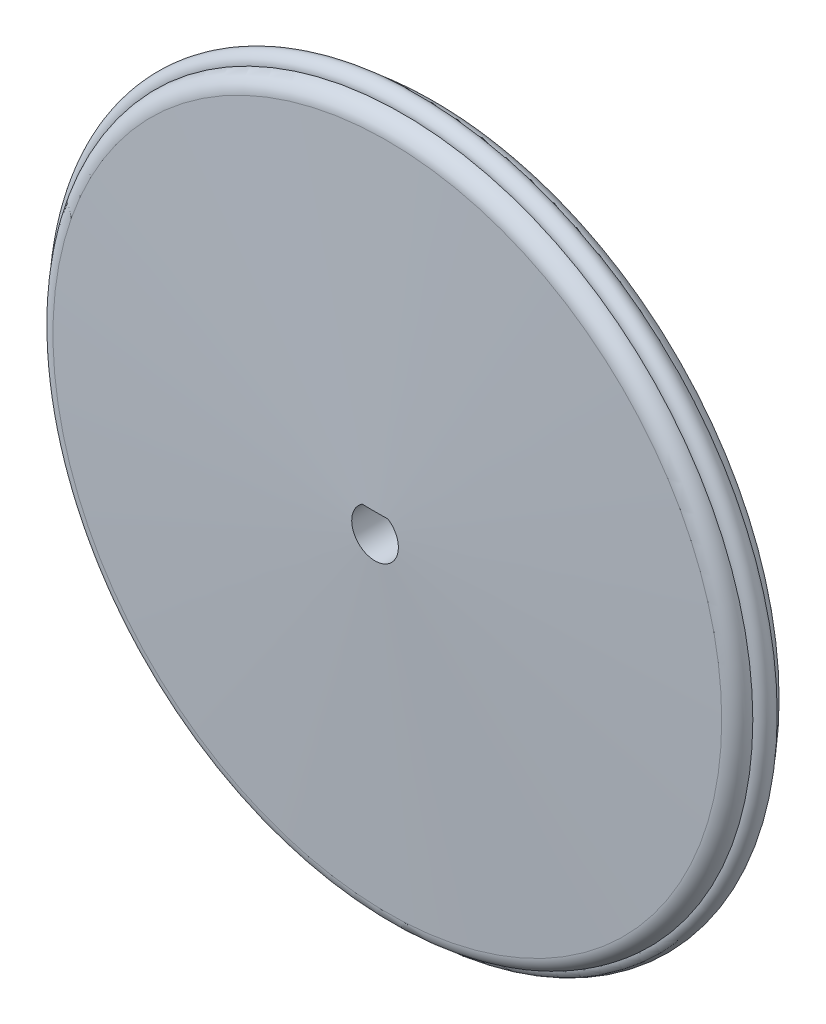
ISO-10303-21;
HEADER;
FILE_DESCRIPTION(('STEP AP214'),'2;1');
FILE_NAME('part.step','',(''),(''),'','','');
FILE_SCHEMA(('AUTOMOTIVE_DESIGN { 1 0 10303 214 1 1 1 1 }'));
ENDSEC;
DATA;
#1=APPLICATION_CONTEXT('core data for automotive mechanical design processes');
#2=APPLICATION_PROTOCOL_DEFINITION('international standard','automotive_design',2000,#1);
#3=PRODUCT_CONTEXT('',#1,'mechanical');
#4=PRODUCT('Part','Part','',(#3));
#5=PRODUCT_RELATED_PRODUCT_CATEGORY('part','',(#4));
#6=PRODUCT_DEFINITION_FORMATION('','',#4);
#7=PRODUCT_DEFINITION_CONTEXT('part definition',#1,'design');
#8=PRODUCT_DEFINITION('design','',#6,#7);
#9=PRODUCT_DEFINITION_SHAPE('','',#8);
#10=(LENGTH_UNIT() NAMED_UNIT(*) SI_UNIT(.MILLI.,.METRE.));
#11=(NAMED_UNIT(*) PLANE_ANGLE_UNIT() SI_UNIT($,.RADIAN.));
#12=(NAMED_UNIT(*) SI_UNIT($,.STERADIAN.) SOLID_ANGLE_UNIT());
#13=UNCERTAINTY_MEASURE_WITH_UNIT(LENGTH_MEASURE(1.E-05),#10,'distance_accuracy_value','');
#14=(GEOMETRIC_REPRESENTATION_CONTEXT(3) GLOBAL_UNCERTAINTY_ASSIGNED_CONTEXT((#13)) GLOBAL_UNIT_ASSIGNED_CONTEXT((#10,
#11,#12)) REPRESENTATION_CONTEXT('',''));
#15=CARTESIAN_POINT('',(0.,0.,0.));
#16=DIRECTION('',(0.,0.,1.));
#17=DIRECTION('',(1.,0.,0.));
#18=AXIS2_PLACEMENT_3D('',#15,#16,#17);
#19=CARTESIAN_POINT('',(0.,0.,3.30000000000004));
#20=DIRECTION('',(0.,0.,-1.));
#21=DIRECTION('',(-1.,0.,0.));
#22=AXIS2_PLACEMENT_3D('',#19,#20,#21);
#23=CONICAL_SURFACE('',#22,43.,1.53128202154591);
#24=CARTESIAN_POINT('',(0.,0.,3.30000000000004));
#25=DIRECTION('',(0.,0.,1.));
#26=DIRECTION('',(1.,0.,0.));
#27=AXIS2_PLACEMENT_3D('',#24,#25,#26);
#28=CIRCLE('',#27,43.);
#29=CARTESIAN_POINT('',(43.,0.,3.30000000000004));
#30=VERTEX_POINT('',#29);
#31=EDGE_CURVE('E114',#30,#30,#28,.T.);
#32=ORIENTED_EDGE('',*,*,#31,.T.);
#33=EDGE_LOOP('',(#32));
#34=FACE_BOUND('',#33,.T.);
#35=CARTESIAN_POINT('',(5.38544142589453,2.5,4.76526471380642));
#36=CARTESIAN_POINT('',(5.13802269785538,2.5,4.77412759585833));
#37=CARTESIAN_POINT('',(4.89060056542726,2.5,4.78289997603868));
#38=CARTESIAN_POINT('',(4.39574523516723,2.5,4.8001312105855));
#39=CARTESIAN_POINT('',(4.14831203732758,2.5,4.80859006472895));
#40=CARTESIAN_POINT('',(3.65335645427772,2.5,4.825064182397));
#41=CARTESIAN_POINT('',(3.40583406457672,2.5,4.83307931211011));
#42=CARTESIAN_POINT('',(2.91076708017209,2.5,4.84842689410449));
#43=CARTESIAN_POINT('',(2.66322248540131,2.5,4.85575934424653));
#44=CARTESIAN_POINT('',(2.16828876931198,2.5,4.8693566223999));
#45=CARTESIAN_POINT('',(1.92089967033717,2.5,4.87562224555692));
#46=CARTESIAN_POINT('',(1.42608483694904,2.5,4.88650287619417));
#47=CARTESIAN_POINT('',(1.17865910272447,2.5,4.89111789190132));
#48=CARTESIAN_POINT('',(0.683808355507392,2.5,4.897939198935));
#49=CARTESIAN_POINT('',(0.436383347742375,2.5,4.9001458438059));
#50=CARTESIAN_POINT('',(-0.0584750757677235,2.5,4.90161592555418));
#51=CARTESIAN_POINT('',(-0.305908491465507,2.5,4.900879376896));
#52=CARTESIAN_POINT('',(-0.75467212344502,2.5,4.89705496355361));
#53=CARTESIAN_POINT('',(-0.956006685739038,2.5,4.89443053273275));
#54=CARTESIAN_POINT('',(-1.35865213247878,2.5,4.8877410639954));
#55=CARTESIAN_POINT('',(-1.55996301679079,2.5,4.8836760183003));
#56=CARTESIAN_POINT('',(-2.16390818490915,2.5,4.86994066011422));
#57=CARTESIAN_POINT('',(-2.56650637712564,2.5,4.85873073627226));
#58=CARTESIAN_POINT('',(-3.37188782325962,2.5,4.83435904913667));
#59=CARTESIAN_POINT('',(-3.77467103845606,2.5,4.82119608807057));
#60=CARTESIAN_POINT('',(-4.37877878872915,2.5,4.80069797450503));
#61=CARTESIAN_POINT('',(-4.58011611937921,2.5,4.79374041364867));
#62=CARTESIAN_POINT('',(-4.98278360316892,2.5,4.77963248265594));
#63=CARTESIAN_POINT('',(-5.18411375632302,2.5,4.77248211293242));
#64=CARTESIAN_POINT('',(-5.38544142589453,2.5,4.76526471380642));
#65=B_SPLINE_CURVE_WITH_KNOTS('',3,(#35,#36,#37,#38,#39,#40,#41,#42,#43,#44,#45,#46,#47,#48,#49,
#50,#51,#52,#53,#54,#55,#56,#57,#58,#59,#60,#61,#62,#63,#64),.UNSPECIFIED.,.F.,.F.,(4,2,2,2,2,2,
2,2,2,2,2,2,2,2,4),(0.,0.742732483444305,1.48546549522354,2.22842128224723,2.97137939732097,
3.7137813108369,4.45617952403672,5.19846873989094,5.9407543077399,6.5448030209636,
7.14885499580039,8.35710476846378,9.56609863161233,10.1704710368959,10.774842148175),.UNSPECIFIED.);
#66=CARTESIAN_POINT('',(1.6583123951777,2.5,4.88139534883722));
#67=VERTEX_POINT('',#66);
#68=CARTESIAN_POINT('',(-1.6583123951777,2.5,4.88139534883722));
#69=VERTEX_POINT('',#68);
#70=EDGE_CURVE('E72',#67,#69,#65,.T.);
#71=ORIENTED_EDGE('',*,*,#70,.F.);
#72=CARTESIAN_POINT('',(0.,0.,4.88139534883722));
#73=DIRECTION('',(0.,0.,-1.));
#74=DIRECTION('',(-1.,0.,0.));
#75=AXIS2_PLACEMENT_3D('',#72,#73,#74);
#76=CIRCLE('',#75,3.);
#77=EDGE_CURVE('E68',#67,#69,#76,.T.);
#78=ORIENTED_EDGE('',*,*,#77,.T.);
#79=EDGE_LOOP('',(#71,#78));
#80=FACE_BOUND('',#79,.T.);
#81=ADVANCED_FACE('F37',(#34,#80),#23,.T.);
#82=CARTESIAN_POINT('',(0.,0.,-5.));
#83=DIRECTION('',(0.,0.,1.));
#84=DIRECTION('',(1.,0.,0.));
#85=AXIS2_PLACEMENT_3D('',#82,#83,#84);
#86=CONICAL_SURFACE('',#85,0.,1.53128202154591);
#87=CARTESIAN_POINT('',(0.,0.,-3.30000000000007));
#88=DIRECTION('',(0.,0.,1.));
#89=DIRECTION('',(1.,0.,0.));
#90=AXIS2_PLACEMENT_3D('',#87,#88,#89);
#91=CIRCLE('',#90,43.);
#92=CARTESIAN_POINT('',(43.,0.,-3.30000000000007));
#93=VERTEX_POINT('',#92);
#94=EDGE_CURVE('E79',#93,#93,#91,.T.);
#95=ORIENTED_EDGE('',*,*,#94,.F.);
#96=EDGE_LOOP('',(#95));
#97=FACE_BOUND('',#96,.T.);
#98=CARTESIAN_POINT('',(-5.38544142589452,2.5,-4.76526471380642));
#99=CARTESIAN_POINT('',(-5.13802269785537,2.5,-4.77412759585834));
#100=CARTESIAN_POINT('',(-4.89060056542724,2.5,-4.78289997603869));
#101=CARTESIAN_POINT('',(-4.39574523516722,2.5,-4.80013121058551));
#102=CARTESIAN_POINT('',(-4.14831203732757,2.5,-4.80859006472895));
#103=CARTESIAN_POINT('',(-3.65335645427771,2.5,-4.82506418239701));
#104=CARTESIAN_POINT('',(-3.40583406457671,2.5,-4.83307931211011));
#105=CARTESIAN_POINT('',(-2.91076708017208,2.5,-4.8484268941045));
#106=CARTESIAN_POINT('',(-2.66322248540131,2.5,-4.85575934424653));
#107=CARTESIAN_POINT('',(-2.16828876931197,2.5,-4.8693566223999));
#108=CARTESIAN_POINT('',(-1.92089967033716,2.5,-4.87562224555692));
#109=CARTESIAN_POINT('',(-1.42608483694903,2.5,-4.88650287619417));
#110=CARTESIAN_POINT('',(-1.17865910272447,2.5,-4.89111789190132));
#111=CARTESIAN_POINT('',(-0.683808355507389,2.5,-4.89793919893501));
#112=CARTESIAN_POINT('',(-0.436383347742372,2.5,-4.90014584380591));
#113=CARTESIAN_POINT('',(0.0584750757677255,2.5,-4.90161592555418));
#114=CARTESIAN_POINT('',(0.305908491465508,2.5,-4.900879376896));
#115=CARTESIAN_POINT('',(0.754672123445021,2.5,-4.89705496355361));
#116=CARTESIAN_POINT('',(0.956006685739038,2.5,-4.89443053273275));
#117=CARTESIAN_POINT('',(1.35865213247878,2.5,-4.8877410639954));
#118=CARTESIAN_POINT('',(1.55996301679078,2.5,-4.8836760183003));
#119=CARTESIAN_POINT('',(2.16390818490915,2.5,-4.86994066011422));
#120=CARTESIAN_POINT('',(2.56650637712563,2.5,-4.85873073627226));
#121=CARTESIAN_POINT('',(3.37188782325961,2.5,-4.83435904913667));
#122=CARTESIAN_POINT('',(3.77467103845605,2.5,-4.82119608807057));
#123=CARTESIAN_POINT('',(4.37877878872914,2.5,-4.80069797450503));
#124=CARTESIAN_POINT('',(4.5801161193792,2.5,-4.79374041364867));
#125=CARTESIAN_POINT('',(4.98278360316891,2.5,-4.77963248265594));
#126=CARTESIAN_POINT('',(5.18411375632301,2.5,-4.77248211293243));
#127=CARTESIAN_POINT('',(5.38544142589451,2.5,-4.76526471380642));
#128=B_SPLINE_CURVE_WITH_KNOTS('',3,(#98,#99,#100,#101,#102,#103,#104,#105,#106,#107,#108,#109,
#110,#111,#112,#113,#114,#115,#116,#117,#118,#119,#120,#121,#122,#123,#124,#125,#126,#127),
.UNSPECIFIED.,.F.,.F.,(4,2,2,2,2,2,2,2,2,2,2,2,2,2,4),(0.,0.742732483444303,1.48546549522353,
2.22842128224723,2.97137939732096,3.71378131083689,4.45617952403671,5.19846873989093,
5.94075430773989,6.54480302096359,7.14885499580037,8.35710476846376,9.5660986316123,
10.1704710368959,10.7748421481749),.UNSPECIFIED.);
#129=CARTESIAN_POINT('',(-1.6583123951777,2.5,-4.88139534883722));
#130=VERTEX_POINT('',#129);
#131=CARTESIAN_POINT('',(1.6583123951777,2.5,-4.88139534883722));
#132=VERTEX_POINT('',#131);
#133=EDGE_CURVE('E11',#130,#132,#128,.T.);
#134=ORIENTED_EDGE('',*,*,#133,.F.);
#135=CARTESIAN_POINT('',(0.,0.,-4.88139534883722));
#136=DIRECTION('',(0.,0.,1.));
#137=DIRECTION('',(1.,0.,0.));
#138=AXIS2_PLACEMENT_3D('',#135,#136,#137);
#139=CIRCLE('',#138,3.);
#140=EDGE_CURVE('E51',#130,#132,#139,.T.);
#141=ORIENTED_EDGE('',*,*,#140,.T.);
#142=EDGE_LOOP('',(#134,#141));
#143=FACE_BOUND('',#142,.T.);
#144=ADVANCED_FACE('F94',(#97,#143),#86,.T.);
#145=CARTESIAN_POINT('',(0.,0.,1.21767554479423));
#146=DIRECTION('',(0.,0.,1.));
#147=DIRECTION('',(1.,0.,0.));
#148=AXIS2_PLACEMENT_3D('',#145,#146,#147);
#149=TOROIDAL_SURFACE('',#148,42.9176755447942,2.08395116369677);
#150=ORIENTED_EDGE('',*,*,#31,.F.);
#151=EDGE_LOOP('',(#150));
#152=FACE_BOUND('',#151,.T.);
#153=CARTESIAN_POINT('',(0.,0.,1.29999999999976));
#154=DIRECTION('',(0.,0.,-1.));
#155=DIRECTION('',(-1.,0.,0.));
#156=AXIS2_PLACEMENT_3D('',#153,#154,#155);
#157=CIRCLE('',#156,44.9999999999998);
#158=CARTESIAN_POINT('',(-44.9999999999998,0.,1.29999999999976));
#159=VERTEX_POINT('',#158);
#160=EDGE_CURVE('E123',#159,#159,#157,.T.);
#161=ORIENTED_EDGE('',*,*,#160,.F.);
#162=EDGE_LOOP('',(#161));
#163=FACE_BOUND('',#162,.T.);
#164=ADVANCED_FACE('F99',(#152,#163),#149,.T.);
#165=CARTESIAN_POINT('',(0.,0.,-1.21767554479425));
#166=DIRECTION('',(0.,0.,1.));
#167=DIRECTION('',(1.,0.,0.));
#168=AXIS2_PLACEMENT_3D('',#165,#166,#167);
#169=TOROIDAL_SURFACE('',#168,42.9176755447942,2.08395116369677);
#170=CARTESIAN_POINT('',(0.,0.,-1.30000000000007));
#171=DIRECTION('',(0.,0.,1.));
#172=DIRECTION('',(1.,0.,0.));
#173=AXIS2_PLACEMENT_3D('',#170,#171,#172);
#174=CIRCLE('',#173,45.);
#175=CARTESIAN_POINT('',(45.,0.,-1.30000000000007));
#176=VERTEX_POINT('',#175);
#177=EDGE_CURVE('E82',#176,#176,#174,.T.);
#178=ORIENTED_EDGE('',*,*,#177,.F.);
#179=EDGE_LOOP('',(#178));
#180=FACE_BOUND('',#179,.T.);
#181=ORIENTED_EDGE('',*,*,#94,.T.);
#182=EDGE_LOOP('',(#181));
#183=FACE_BOUND('',#182,.T.);
#184=ADVANCED_FACE('F92',(#180,#183),#169,.T.);
#185=CARTESIAN_POINT('',(-1.6583123951777,2.5,-5.));
#186=DIRECTION('',(0.,-1.,0.));
#187=DIRECTION('',(0.,0.,-1.));
#188=AXIS2_PLACEMENT_3D('',#185,#186,#187);
#189=PLANE('',#188);
#190=ORIENTED_EDGE('',*,*,#70,.T.);
#191=DIRECTION('',(0.,0.,1.));
#192=VECTOR('',#191,1.);
#193=CARTESIAN_POINT('',(-1.6583123951777,2.5,-5.));
#194=LINE('',#193,#192);
#195=EDGE_CURVE('E58',#130,#69,#194,.T.);
#196=ORIENTED_EDGE('',*,*,#195,.F.);
#197=ORIENTED_EDGE('',*,*,#133,.T.);
#198=DIRECTION('',(0.,0.,1.));
#199=VECTOR('',#198,1.);
#200=CARTESIAN_POINT('',(1.6583123951777,2.5,-5.));
#201=LINE('',#200,#199);
#202=EDGE_CURVE('E63',#132,#67,#201,.T.);
#203=ORIENTED_EDGE('',*,*,#202,.T.);
#204=EDGE_LOOP('',(#190,#196,#197,#203));
#205=FACE_BOUND('',#204,.T.);
#206=ADVANCED_FACE('F75',(#205),#189,.T.);
#207=CARTESIAN_POINT('',(0.,0.,-5.));
#208=DIRECTION('',(0.,0.,1.));
#209=DIRECTION('',(1.,0.,0.));
#210=AXIS2_PLACEMENT_3D('',#207,#208,#209);
#211=CYLINDRICAL_SURFACE('',#210,3.);
#212=ORIENTED_EDGE('',*,*,#202,.F.);
#213=ORIENTED_EDGE('',*,*,#140,.F.);
#214=ORIENTED_EDGE('',*,*,#195,.T.);
#215=ORIENTED_EDGE('',*,*,#77,.F.);
#216=EDGE_LOOP('',(#212,#213,#214,#215));
#217=FACE_BOUND('',#216,.T.);
#218=ADVANCED_FACE('F69',(#217),#211,.F.);
#219=CARTESIAN_POINT('',(0.,0.,0.));
#220=DIRECTION('',(0.,0.,1.));
#221=DIRECTION('',(1.,0.,0.));
#222=AXIS2_PLACEMENT_3D('',#219,#220,#221);
#223=TOROIDAL_SURFACE('',#222,45.,1.30000000000005);
#224=ORIENTED_EDGE('',*,*,#160,.T.);
#225=EDGE_LOOP('',(#224));
#226=FACE_BOUND('',#225,.T.);
#227=ORIENTED_EDGE('',*,*,#177,.T.);
#228=EDGE_LOOP('',(#227));
#229=FACE_BOUND('',#228,.T.);
#230=ADVANCED_FACE('F119',(#226,#229),#223,.T.);
#231=CLOSED_SHELL('',(#81,#144,#164,#184,#206,#218,#230));
#232=MANIFOLD_SOLID_BREP('B2',#231);
#233=ADVANCED_BREP_SHAPE_REPRESENTATION('',(#18,#232),#14);
#234=SHAPE_DEFINITION_REPRESENTATION(#9,#233);
ENDSEC;
END-ISO-10303-21;
